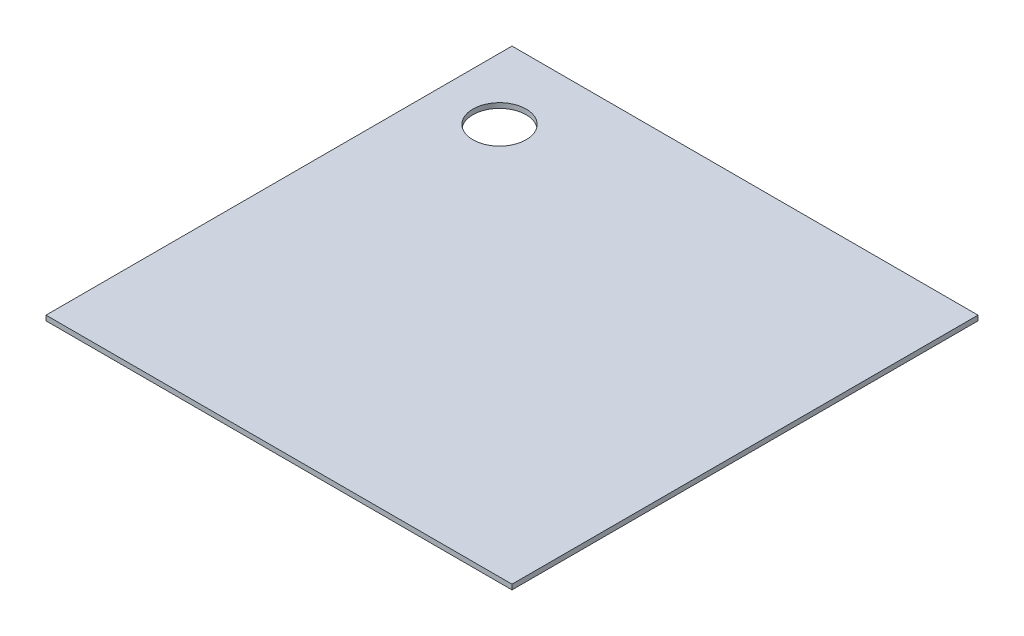
ISO-10303-21;
HEADER;
FILE_DESCRIPTION(('STEP AP214'),'2;1');
FILE_NAME('part.step','',(''),(''),'','','');
FILE_SCHEMA(('AUTOMOTIVE_DESIGN { 1 0 10303 214 1 1 1 1 }'));
ENDSEC;
DATA;
#1=APPLICATION_CONTEXT('core data for automotive mechanical design processes');
#2=APPLICATION_PROTOCOL_DEFINITION('international standard','automotive_design',2000,#1);
#3=PRODUCT_CONTEXT('',#1,'mechanical');
#4=PRODUCT('Part','Part','',(#3));
#5=PRODUCT_RELATED_PRODUCT_CATEGORY('part','',(#4));
#6=PRODUCT_DEFINITION_FORMATION('','',#4);
#7=PRODUCT_DEFINITION_CONTEXT('part definition',#1,'design');
#8=PRODUCT_DEFINITION('design','',#6,#7);
#9=PRODUCT_DEFINITION_SHAPE('','',#8);
#10=(LENGTH_UNIT() NAMED_UNIT(*) SI_UNIT(.MILLI.,.METRE.));
#11=(NAMED_UNIT(*) PLANE_ANGLE_UNIT() SI_UNIT($,.RADIAN.));
#12=(NAMED_UNIT(*) SI_UNIT($,.STERADIAN.) SOLID_ANGLE_UNIT());
#13=UNCERTAINTY_MEASURE_WITH_UNIT(LENGTH_MEASURE(1.E-05),#10,'distance_accuracy_value','');
#14=(GEOMETRIC_REPRESENTATION_CONTEXT(3) GLOBAL_UNCERTAINTY_ASSIGNED_CONTEXT((#13)) GLOBAL_UNIT_ASSIGNED_CONTEXT((#10,
#11,#12)) REPRESENTATION_CONTEXT('',''));
#15=CARTESIAN_POINT('',(0.,0.,0.));
#16=DIRECTION('',(0.,0.,1.));
#17=DIRECTION('',(1.,0.,0.));
#18=AXIS2_PLACEMENT_3D('',#15,#16,#17);
#19=CARTESIAN_POINT('',(0.,1.5,0.));
#20=DIRECTION('',(0.,1.,0.));
#21=DIRECTION('',(0.,0.,1.));
#22=AXIS2_PLACEMENT_3D('',#19,#20,#21);
#23=PLANE('',#22);
#24=DIRECTION('',(0.,0.,1.));
#25=VECTOR('',#24,1.);
#26=CARTESIAN_POINT('',(-140.,1.5,140.));
#27=LINE('',#26,#25);
#28=CARTESIAN_POINT('',(-140.,1.5,-140.));
#29=VERTEX_POINT('',#28);
#30=CARTESIAN_POINT('',(-140.,1.5,140.));
#31=VERTEX_POINT('',#30);
#32=EDGE_CURVE('E101',#29,#31,#27,.T.);
#33=ORIENTED_EDGE('',*,*,#32,.T.);
#34=DIRECTION('',(1.,0.,0.));
#35=VECTOR('',#34,1.);
#36=CARTESIAN_POINT('',(140.,1.5,140.));
#37=LINE('',#36,#35);
#38=CARTESIAN_POINT('',(140.,1.5,140.));
#39=VERTEX_POINT('',#38);
#40=EDGE_CURVE('E96',#31,#39,#37,.T.);
#41=ORIENTED_EDGE('',*,*,#40,.T.);
#42=DIRECTION('',(0.,0.,-1.));
#43=VECTOR('',#42,1.);
#44=CARTESIAN_POINT('',(140.,1.5,140.));
#45=LINE('',#44,#43);
#46=CARTESIAN_POINT('',(140.,1.5,-140.));
#47=VERTEX_POINT('',#46);
#48=EDGE_CURVE('E99',#39,#47,#45,.T.);
#49=ORIENTED_EDGE('',*,*,#48,.T.);
#50=DIRECTION('',(-1.,0.,0.));
#51=VECTOR('',#50,1.);
#52=CARTESIAN_POINT('',(140.,1.5,-140.));
#53=LINE('',#52,#51);
#54=EDGE_CURVE('E66',#47,#29,#53,.T.);
#55=ORIENTED_EDGE('',*,*,#54,.T.);
#56=EDGE_LOOP('',(#33,#41,#49,#55));
#57=FACE_BOUND('',#56,.T.);
#58=CARTESIAN_POINT('',(-103.,1.5,-95.5));
#59=DIRECTION('',(0.,1.,0.));
#60=DIRECTION('',(0.,0.,1.));
#61=AXIS2_PLACEMENT_3D('',#58,#59,#60);
#62=CIRCLE('',#61,16.);
#63=CARTESIAN_POINT('',(-103.,1.5,-79.5));
#64=VERTEX_POINT('',#63);
#65=EDGE_CURVE('E116',#64,#64,#62,.T.);
#66=ORIENTED_EDGE('',*,*,#65,.F.);
#67=EDGE_LOOP('',(#66));
#68=FACE_BOUND('',#67,.T.);
#69=ADVANCED_FACE('F49',(#57,#68),#23,.T.);
#70=CARTESIAN_POINT('',(0.,-1.5,0.));
#71=DIRECTION('',(0.,1.,0.));
#72=DIRECTION('',(0.,0.,1.));
#73=AXIS2_PLACEMENT_3D('',#70,#71,#72);
#74=PLANE('',#73);
#75=DIRECTION('',(0.,0.,1.));
#76=VECTOR('',#75,1.);
#77=CARTESIAN_POINT('',(-140.,-1.5,140.));
#78=LINE('',#77,#76);
#79=CARTESIAN_POINT('',(-140.,-1.5,-140.));
#80=VERTEX_POINT('',#79);
#81=CARTESIAN_POINT('',(-140.,-1.5,140.));
#82=VERTEX_POINT('',#81);
#83=EDGE_CURVE('E113',#80,#82,#78,.T.);
#84=ORIENTED_EDGE('',*,*,#83,.F.);
#85=DIRECTION('',(-1.,0.,0.));
#86=VECTOR('',#85,1.);
#87=CARTESIAN_POINT('',(140.,-1.5,-140.));
#88=LINE('',#87,#86);
#89=CARTESIAN_POINT('',(140.,-1.5,-140.));
#90=VERTEX_POINT('',#89);
#91=EDGE_CURVE('E89',#90,#80,#88,.T.);
#92=ORIENTED_EDGE('',*,*,#91,.F.);
#93=DIRECTION('',(0.,0.,-1.));
#94=VECTOR('',#93,1.);
#95=CARTESIAN_POINT('',(140.,-1.5,140.));
#96=LINE('',#95,#94);
#97=CARTESIAN_POINT('',(140.,-1.5,140.));
#98=VERTEX_POINT('',#97);
#99=EDGE_CURVE('E83',#98,#90,#96,.T.);
#100=ORIENTED_EDGE('',*,*,#99,.F.);
#101=DIRECTION('',(1.,0.,0.));
#102=VECTOR('',#101,1.);
#103=CARTESIAN_POINT('',(140.,-1.5,140.));
#104=LINE('',#103,#102);
#105=EDGE_CURVE('E105',#82,#98,#104,.T.);
#106=ORIENTED_EDGE('',*,*,#105,.F.);
#107=EDGE_LOOP('',(#84,#92,#100,#106));
#108=FACE_BOUND('',#107,.T.);
#109=CARTESIAN_POINT('',(-103.,-1.5,-95.5));
#110=DIRECTION('',(0.,1.,0.));
#111=DIRECTION('',(0.,0.,1.));
#112=AXIS2_PLACEMENT_3D('',#109,#110,#111);
#113=CIRCLE('',#112,16.);
#114=CARTESIAN_POINT('',(-103.,-1.5,-79.5));
#115=VERTEX_POINT('',#114);
#116=EDGE_CURVE('E128',#115,#115,#113,.T.);
#117=ORIENTED_EDGE('',*,*,#116,.T.);
#118=EDGE_LOOP('',(#117));
#119=FACE_BOUND('',#118,.T.);
#120=ADVANCED_FACE('F124',(#108,#119),#74,.F.);
#121=CARTESIAN_POINT('',(-140.,1.5,140.));
#122=DIRECTION('',(1.,0.,0.));
#123=DIRECTION('',(0.,0.,-1.));
#124=AXIS2_PLACEMENT_3D('',#121,#122,#123);
#125=PLANE('',#124);
#126=ORIENTED_EDGE('',*,*,#83,.T.);
#127=DIRECTION('',(0.,-1.,0.));
#128=VECTOR('',#127,1.);
#129=CARTESIAN_POINT('',(-140.,1.5,140.));
#130=LINE('',#129,#128);
#131=EDGE_CURVE('E11',#31,#82,#130,.T.);
#132=ORIENTED_EDGE('',*,*,#131,.F.);
#133=ORIENTED_EDGE('',*,*,#32,.F.);
#134=DIRECTION('',(0.,-1.,0.));
#135=VECTOR('',#134,1.);
#136=CARTESIAN_POINT('',(-140.,1.5,-140.));
#137=LINE('',#136,#135);
#138=EDGE_CURVE('E109',#29,#80,#137,.T.);
#139=ORIENTED_EDGE('',*,*,#138,.T.);
#140=EDGE_LOOP('',(#126,#132,#133,#139));
#141=FACE_BOUND('',#140,.T.);
#142=ADVANCED_FACE('F51',(#141),#125,.F.);
#143=CARTESIAN_POINT('',(140.,1.5,140.));
#144=DIRECTION('',(0.,0.,-1.));
#145=DIRECTION('',(-1.,0.,0.));
#146=AXIS2_PLACEMENT_3D('',#143,#144,#145);
#147=PLANE('',#146);
#148=ORIENTED_EDGE('',*,*,#105,.T.);
#149=DIRECTION('',(0.,-1.,0.));
#150=VECTOR('',#149,1.);
#151=CARTESIAN_POINT('',(140.,1.5,140.));
#152=LINE('',#151,#150);
#153=EDGE_CURVE('E58',#39,#98,#152,.T.);
#154=ORIENTED_EDGE('',*,*,#153,.F.);
#155=ORIENTED_EDGE('',*,*,#40,.F.);
#156=ORIENTED_EDGE('',*,*,#131,.T.);
#157=EDGE_LOOP('',(#148,#154,#155,#156));
#158=FACE_BOUND('',#157,.T.);
#159=ADVANCED_FACE('F104',(#158),#147,.F.);
#160=CARTESIAN_POINT('',(140.,1.5,140.));
#161=DIRECTION('',(-1.,0.,0.));
#162=DIRECTION('',(0.,0.,1.));
#163=AXIS2_PLACEMENT_3D('',#160,#161,#162);
#164=PLANE('',#163);
#165=ORIENTED_EDGE('',*,*,#99,.T.);
#166=DIRECTION('',(0.,-1.,0.));
#167=VECTOR('',#166,1.);
#168=CARTESIAN_POINT('',(140.,1.5,-140.));
#169=LINE('',#168,#167);
#170=EDGE_CURVE('E106',#47,#90,#169,.T.);
#171=ORIENTED_EDGE('',*,*,#170,.F.);
#172=ORIENTED_EDGE('',*,*,#48,.F.);
#173=ORIENTED_EDGE('',*,*,#153,.T.);
#174=EDGE_LOOP('',(#165,#171,#172,#173));
#175=FACE_BOUND('',#174,.T.);
#176=ADVANCED_FACE('F107',(#175),#164,.F.);
#177=CARTESIAN_POINT('',(140.,1.5,-140.));
#178=DIRECTION('',(0.,0.,1.));
#179=DIRECTION('',(1.,0.,0.));
#180=AXIS2_PLACEMENT_3D('',#177,#178,#179);
#181=PLANE('',#180);
#182=ORIENTED_EDGE('',*,*,#91,.T.);
#183=ORIENTED_EDGE('',*,*,#138,.F.);
#184=ORIENTED_EDGE('',*,*,#54,.F.);
#185=ORIENTED_EDGE('',*,*,#170,.T.);
#186=EDGE_LOOP('',(#182,#183,#184,#185));
#187=FACE_BOUND('',#186,.T.);
#188=ADVANCED_FACE('F121',(#187),#181,.F.);
#189=CARTESIAN_POINT('',(-103.,1.5,-95.5));
#190=DIRECTION('',(0.,-1.,0.));
#191=DIRECTION('',(0.,0.,-1.));
#192=AXIS2_PLACEMENT_3D('',#189,#190,#191);
#193=CYLINDRICAL_SURFACE('',#192,16.);
#194=ORIENTED_EDGE('',*,*,#65,.T.);
#195=EDGE_LOOP('',(#194));
#196=FACE_BOUND('',#195,.T.);
#197=ORIENTED_EDGE('',*,*,#116,.F.);
#198=EDGE_LOOP('',(#197));
#199=FACE_BOUND('',#198,.T.);
#200=ADVANCED_FACE('F134',(#196,#199),#193,.F.);
#201=CLOSED_SHELL('',(#69,#120,#142,#159,#176,#188,#200));
#202=MANIFOLD_SOLID_BREP('B2',#201);
#203=ADVANCED_BREP_SHAPE_REPRESENTATION('',(#18,#202),#14);
#204=SHAPE_DEFINITION_REPRESENTATION(#9,#203);
ENDSEC;
END-ISO-10303-21;
